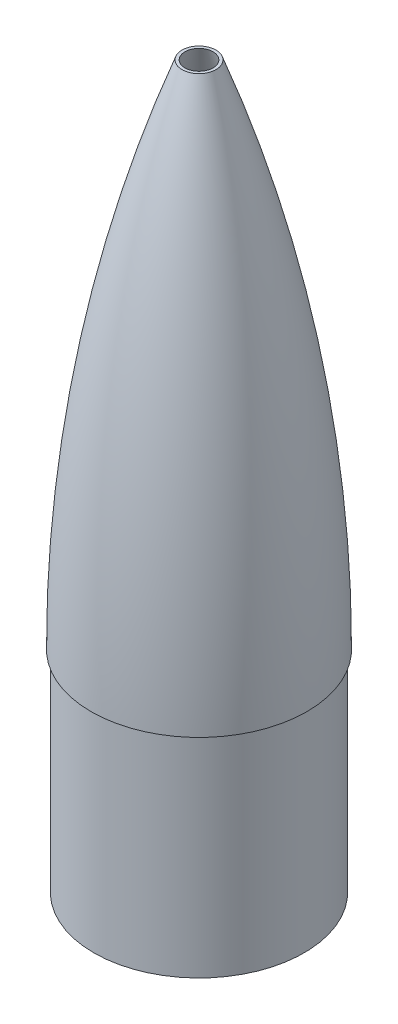
ISO-10303-21;
HEADER;
FILE_DESCRIPTION(('STEP AP214'),'2;1');
FILE_NAME('part.step','',(''),(''),'','','');
FILE_SCHEMA(('AUTOMOTIVE_DESIGN { 1 0 10303 214 1 1 1 1 }'));
ENDSEC;
DATA;
#1=APPLICATION_CONTEXT('core data for automotive mechanical design processes');
#2=APPLICATION_PROTOCOL_DEFINITION('international standard','automotive_design',2000,#1);
#3=PRODUCT_CONTEXT('',#1,'mechanical');
#4=PRODUCT('Part','Part','',(#3));
#5=PRODUCT_RELATED_PRODUCT_CATEGORY('part','',(#4));
#6=PRODUCT_DEFINITION_FORMATION('','',#4);
#7=PRODUCT_DEFINITION_CONTEXT('part definition',#1,'design');
#8=PRODUCT_DEFINITION('design','',#6,#7);
#9=PRODUCT_DEFINITION_SHAPE('','',#8);
#10=(LENGTH_UNIT() NAMED_UNIT(*) SI_UNIT(.MILLI.,.METRE.));
#11=(NAMED_UNIT(*) PLANE_ANGLE_UNIT() SI_UNIT($,.RADIAN.));
#12=(NAMED_UNIT(*) SI_UNIT($,.STERADIAN.) SOLID_ANGLE_UNIT());
#13=UNCERTAINTY_MEASURE_WITH_UNIT(LENGTH_MEASURE(1.E-05),#10,'distance_accuracy_value','');
#14=(GEOMETRIC_REPRESENTATION_CONTEXT(3) GLOBAL_UNCERTAINTY_ASSIGNED_CONTEXT((#13)) GLOBAL_UNIT_ASSIGNED_CONTEXT((#10,
#11,#12)) REPRESENTATION_CONTEXT('',''));
#15=CARTESIAN_POINT('',(0.,0.,0.));
#16=DIRECTION('',(0.,0.,1.));
#17=DIRECTION('',(1.,0.,0.));
#18=AXIS2_PLACEMENT_3D('',#15,#16,#17);
#19=CARTESIAN_POINT('',(0.,0.,0.));
#20=DIRECTION('',(0.,1.,0.));
#21=DIRECTION('',(0.,0.,1.));
#22=AXIS2_PLACEMENT_3D('',#19,#20,#21);
#23=DEGENERATE_TOROIDAL_SURFACE('',#22,993.420310811265,1071.62031081127,.F.);
#24=CARTESIAN_POINT('',(0.,370.,0.));
#25=DIRECTION('',(0.,-1.,0.));
#26=DIRECTION('',(0.,0.,-1.));
#27=AXIS2_PLACEMENT_3D('',#24,#25,#26);
#28=CIRCLE('',#27,12.2983827324279);
#29=CARTESIAN_POINT('',(0.,370.,-12.2983827324279));
#30=VERTEX_POINT('',#29);
#31=EDGE_CURVE('E63',#30,#30,#28,.T.);
#32=ORIENTED_EDGE('',*,*,#31,.T.);
#33=EDGE_LOOP('',(#32));
#34=FACE_BOUND('',#33,.T.);
#35=CARTESIAN_POINT('',(0.,0.,0.));
#36=DIRECTION('',(0.,1.,0.));
#37=DIRECTION('',(0.,0.,1.));
#38=AXIS2_PLACEMENT_3D('',#35,#36,#37);
#39=CIRCLE('',#38,78.2);
#40=CARTESIAN_POINT('',(0.,0.,78.2));
#41=VERTEX_POINT('',#40);
#42=EDGE_CURVE('E45',#41,#41,#39,.T.);
#43=ORIENTED_EDGE('',*,*,#42,.T.);
#44=EDGE_LOOP('',(#43));
#45=FACE_BOUND('',#44,.T.);
#46=ADVANCED_FACE('F38',(#34,#45),#23,.F.);
#47=CARTESIAN_POINT('',(78.2,0.,0.));
#48=DIRECTION('',(0.,-1.,0.));
#49=DIRECTION('',(0.,0.,-1.));
#50=AXIS2_PLACEMENT_3D('',#47,#48,#49);
#51=PLANE('',#50);
#52=CARTESIAN_POINT('',(0.,0.,0.));
#53=DIRECTION('',(0.,-1.,0.));
#54=DIRECTION('',(0.,0.,-1.));
#55=AXIS2_PLACEMENT_3D('',#52,#53,#54);
#56=CIRCLE('',#55,76.2);
#57=CARTESIAN_POINT('',(0.,0.,-76.2));
#58=VERTEX_POINT('',#57);
#59=EDGE_CURVE('E49',#58,#58,#56,.F.);
#60=ORIENTED_EDGE('',*,*,#59,.T.);
#61=EDGE_LOOP('',(#60));
#62=FACE_BOUND('',#61,.T.);
#63=ORIENTED_EDGE('',*,*,#42,.F.);
#64=EDGE_LOOP('',(#63));
#65=FACE_BOUND('',#64,.T.);
#66=ADVANCED_FACE('F87',(#62,#65),#51,.T.);
#67=CARTESIAN_POINT('',(0.,10.,0.));
#68=DIRECTION('',(0.,1.,0.));
#69=DIRECTION('',(0.,0.,1.));
#70=AXIS2_PLACEMENT_3D('',#67,#68,#69);
#71=PLANE('',#70);
#72=CARTESIAN_POINT('',(0.,10.,0.));
#73=DIRECTION('',(0.,1.,0.));
#74=DIRECTION('',(0.,0.,1.));
#75=AXIS2_PLACEMENT_3D('',#72,#73,#74);
#76=CIRCLE('',#75,74.2);
#77=CARTESIAN_POINT('',(0.,10.,74.2));
#78=VERTEX_POINT('',#77);
#79=EDGE_CURVE('E54',#78,#78,#76,.T.);
#80=ORIENTED_EDGE('',*,*,#79,.F.);
#81=EDGE_LOOP('',(#80));
#82=FACE_BOUND('',#81,.T.);
#83=CARTESIAN_POINT('',(0.,10.,0.));
#84=DIRECTION('',(0.,1.,0.));
#85=DIRECTION('',(0.,0.,1.));
#86=AXIS2_PLACEMENT_3D('',#83,#84,#85);
#87=CIRCLE('',#86,76.1532534188851);
#88=CARTESIAN_POINT('',(0.,10.,76.1532534188851));
#89=VERTEX_POINT('',#88);
#90=EDGE_CURVE('E10',#89,#89,#87,.T.);
#91=ORIENTED_EDGE('',*,*,#90,.T.);
#92=EDGE_LOOP('',(#91));
#93=FACE_BOUND('',#92,.T.);
#94=ADVANCED_FACE('F91',(#82,#93),#71,.T.);
#95=CARTESIAN_POINT('',(0.,10.,0.));
#96=DIRECTION('',(0.,-1.,0.));
#97=DIRECTION('',(0.,0.,-1.));
#98=AXIS2_PLACEMENT_3D('',#95,#96,#97);
#99=CYLINDRICAL_SURFACE('',#98,76.2);
#100=ORIENTED_EDGE('',*,*,#59,.F.);
#101=EDGE_LOOP('',(#100));
#102=FACE_BOUND('',#101,.T.);
#103=CARTESIAN_POINT('',(0.,-152.4,0.));
#104=DIRECTION('',(0.,1.,0.));
#105=DIRECTION('',(0.,0.,1.));
#106=AXIS2_PLACEMENT_3D('',#103,#104,#105);
#107=CIRCLE('',#106,76.2);
#108=CARTESIAN_POINT('',(0.,-152.4,76.2));
#109=VERTEX_POINT('',#108);
#110=EDGE_CURVE('E57',#109,#109,#107,.T.);
#111=ORIENTED_EDGE('',*,*,#110,.T.);
#112=EDGE_LOOP('',(#111));
#113=FACE_BOUND('',#112,.T.);
#114=ADVANCED_FACE('F99',(#102,#113),#99,.T.);
#115=CARTESIAN_POINT('',(0.,10.,0.));
#116=DIRECTION('',(0.,-1.,0.));
#117=DIRECTION('',(0.,0.,-1.));
#118=AXIS2_PLACEMENT_3D('',#115,#116,#117);
#119=CYLINDRICAL_SURFACE('',#118,74.2);
#120=ORIENTED_EDGE('',*,*,#79,.T.);
#121=EDGE_LOOP('',(#120));
#122=FACE_BOUND('',#121,.T.);
#123=CARTESIAN_POINT('',(0.,-152.4,0.));
#124=DIRECTION('',(0.,1.,0.));
#125=DIRECTION('',(0.,0.,1.));
#126=AXIS2_PLACEMENT_3D('',#123,#124,#125);
#127=CIRCLE('',#126,74.2);
#128=CARTESIAN_POINT('',(0.,-152.4,74.2));
#129=VERTEX_POINT('',#128);
#130=EDGE_CURVE('E60',#129,#129,#127,.T.);
#131=ORIENTED_EDGE('',*,*,#130,.F.);
#132=EDGE_LOOP('',(#131));
#133=FACE_BOUND('',#132,.T.);
#134=ADVANCED_FACE('F82',(#122,#133),#119,.F.);
#135=CARTESIAN_POINT('',(0.,-152.4,0.));
#136=DIRECTION('',(0.,1.,0.));
#137=DIRECTION('',(0.,0.,1.));
#138=AXIS2_PLACEMENT_3D('',#135,#136,#137);
#139=PLANE('',#138);
#140=ORIENTED_EDGE('',*,*,#130,.T.);
#141=EDGE_LOOP('',(#140));
#142=FACE_BOUND('',#141,.T.);
#143=ORIENTED_EDGE('',*,*,#110,.F.);
#144=EDGE_LOOP('',(#143));
#145=FACE_BOUND('',#144,.T.);
#146=ADVANCED_FACE('F76',(#142,#145),#139,.F.);
#147=CARTESIAN_POINT('',(0.,0.,0.));
#148=DIRECTION('',(0.,1.,0.));
#149=DIRECTION('',(0.,0.,1.));
#150=AXIS2_PLACEMENT_3D('',#147,#148,#149);
#151=DEGENERATE_TOROIDAL_SURFACE('',#150,993.420310811265,1069.62031081127,.F.);
#152=CARTESIAN_POINT('',(0.,370.,0.));
#153=DIRECTION('',(0.,-1.,0.));
#154=DIRECTION('',(0.,0.,-1.));
#155=AXIS2_PLACEMENT_3D('',#152,#153,#154);
#156=CIRCLE('',#155,10.1670592268335);
#157=CARTESIAN_POINT('',(0.,370.,-10.1670592268335));
#158=VERTEX_POINT('',#157);
#159=EDGE_CURVE('E41',#158,#158,#156,.T.);
#160=ORIENTED_EDGE('',*,*,#159,.F.);
#161=EDGE_LOOP('',(#160));
#162=FACE_BOUND('',#161,.T.);
#163=ORIENTED_EDGE('',*,*,#90,.F.);
#164=EDGE_LOOP('',(#163));
#165=FACE_BOUND('',#164,.T.);
#166=ADVANCED_FACE('F73',(#162,#165),#151,.T.);
#167=CARTESIAN_POINT('',(0.,370.,0.));
#168=DIRECTION('',(0.,-1.,0.));
#169=DIRECTION('',(0.,0.,-1.));
#170=AXIS2_PLACEMENT_3D('',#167,#168,#169);
#171=PLANE('',#170);
#172=ORIENTED_EDGE('',*,*,#159,.T.);
#173=EDGE_LOOP('',(#172));
#174=FACE_BOUND('',#173,.T.);
#175=ORIENTED_EDGE('',*,*,#31,.F.);
#176=EDGE_LOOP('',(#175));
#177=FACE_BOUND('',#176,.T.);
#178=ADVANCED_FACE('F70',(#174,#177),#171,.F.);
#179=CLOSED_SHELL('',(#46,#66,#94,#114,#134,#146,#166,#178));
#180=MANIFOLD_SOLID_BREP('B2',#179);
#181=ADVANCED_BREP_SHAPE_REPRESENTATION('',(#18,#180),#14);
#182=SHAPE_DEFINITION_REPRESENTATION(#9,#181);
ENDSEC;
END-ISO-10303-21;
